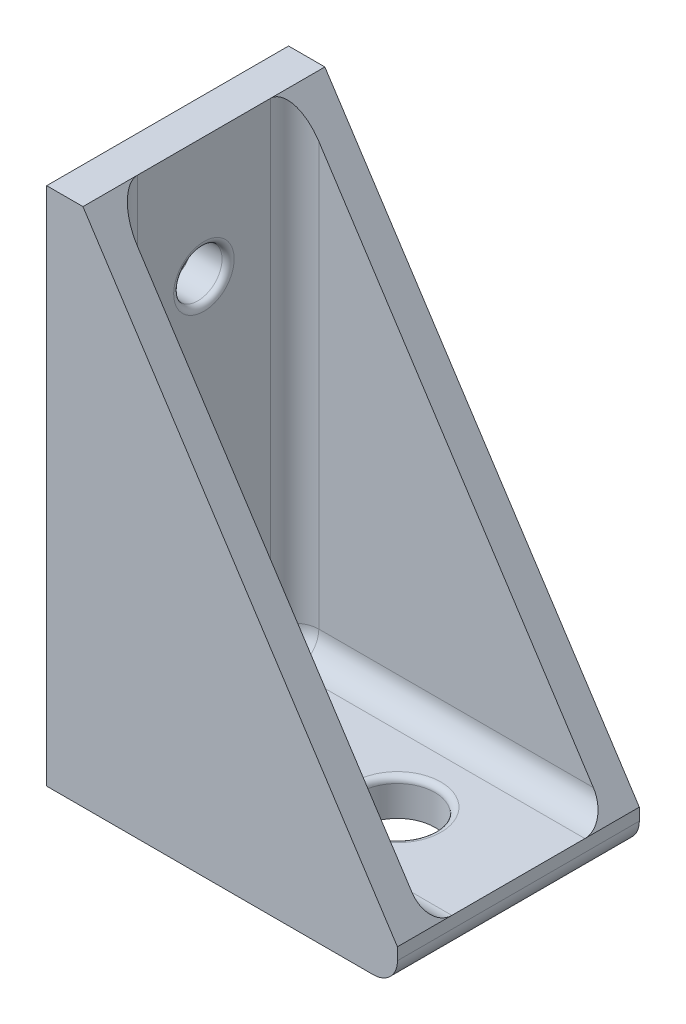
ISO-10303-21;
HEADER;
FILE_DESCRIPTION(('STEP AP214'),'2;1');
FILE_NAME('part.step','',(''),(''),'','','');
FILE_SCHEMA(('AUTOMOTIVE_DESIGN { 1 0 10303 214 1 1 1 1 }'));
ENDSEC;
DATA;
#1=APPLICATION_CONTEXT('core data for automotive mechanical design processes');
#2=APPLICATION_PROTOCOL_DEFINITION('international standard','automotive_design',2000,#1);
#3=PRODUCT_CONTEXT('',#1,'mechanical');
#4=PRODUCT('Part','Part','',(#3));
#5=PRODUCT_RELATED_PRODUCT_CATEGORY('part','',(#4));
#6=PRODUCT_DEFINITION_FORMATION('','',#4);
#7=PRODUCT_DEFINITION_CONTEXT('part definition',#1,'design');
#8=PRODUCT_DEFINITION('design','',#6,#7);
#9=PRODUCT_DEFINITION_SHAPE('','',#8);
#10=(LENGTH_UNIT() NAMED_UNIT(*) SI_UNIT(.MILLI.,.METRE.));
#11=(NAMED_UNIT(*) PLANE_ANGLE_UNIT() SI_UNIT($,.RADIAN.));
#12=(NAMED_UNIT(*) SI_UNIT($,.STERADIAN.) SOLID_ANGLE_UNIT());
#13=UNCERTAINTY_MEASURE_WITH_UNIT(LENGTH_MEASURE(1.E-05),#10,'distance_accuracy_value','');
#14=(GEOMETRIC_REPRESENTATION_CONTEXT(3) GLOBAL_UNCERTAINTY_ASSIGNED_CONTEXT((#13)) GLOBAL_UNIT_ASSIGNED_CONTEXT((#10,
#11,#12)) REPRESENTATION_CONTEXT('',''));
#15=CARTESIAN_POINT('',(0.,0.,0.));
#16=DIRECTION('',(0.,0.,1.));
#17=DIRECTION('',(1.,0.,0.));
#18=AXIS2_PLACEMENT_3D('',#15,#16,#17);
#19=CARTESIAN_POINT('',(29.,3.,20.));
#20=DIRECTION('',(0.,-1.,0.));
#21=DIRECTION('',(1.,0.,0.));
#22=AXIS2_PLACEMENT_3D('',#19,#20,#21);
#23=PLANE('',#22);
#24=CARTESIAN_POINT('',(19.,3.,10.));
#25=DIRECTION('',(0.,-1.,0.));
#26=DIRECTION('',(1.,0.,0.));
#27=AXIS2_PLACEMENT_3D('',#24,#25,#26);
#28=CIRCLE('',#27,3.6);
#29=CARTESIAN_POINT('',(22.6,3.,10.));
#30=VERTEX_POINT('',#29);
#31=EDGE_CURVE('E41',#30,#30,#28,.T.);
#32=ORIENTED_EDGE('',*,*,#31,.T.);
#33=EDGE_LOOP('',(#32));
#34=FACE_BOUND('',#33,.T.);
#35=DIRECTION('',(0.,0.,-1.));
#36=VECTOR('',#35,1.);
#37=CARTESIAN_POINT('',(5.,3.,17.5));
#38=LINE('',#37,#36);
#39=CARTESIAN_POINT('',(5.,3.,4.5));
#40=VERTEX_POINT('',#39);
#41=CARTESIAN_POINT('',(5.,3.,15.5));
#42=VERTEX_POINT('',#41);
#43=EDGE_CURVE('E307',#40,#42,#38,.F.);
#44=ORIENTED_EDGE('',*,*,#43,.T.);
#45=DIRECTION('',(1.,0.,0.));
#46=VECTOR('',#45,1.);
#47=CARTESIAN_POINT('',(29.,3.,15.5));
#48=LINE('',#47,#46);
#49=CARTESIAN_POINT('',(29.,3.,15.5));
#50=VERTEX_POINT('',#49);
#51=EDGE_CURVE('E311',#42,#50,#48,.T.);
#52=ORIENTED_EDGE('',*,*,#51,.T.);
#53=DIRECTION('',(0.,0.,-1.));
#54=VECTOR('',#53,1.);
#55=CARTESIAN_POINT('',(29.,3.,20.));
#56=LINE('',#55,#54);
#57=CARTESIAN_POINT('',(29.,3.,4.5));
#58=VERTEX_POINT('',#57);
#59=EDGE_CURVE('E285',#50,#58,#56,.T.);
#60=ORIENTED_EDGE('',*,*,#59,.T.);
#61=DIRECTION('',(-1.,0.,0.));
#62=VECTOR('',#61,1.);
#63=CARTESIAN_POINT('',(29.,3.,4.5));
#64=LINE('',#63,#62);
#65=EDGE_CURVE('E120',#58,#40,#64,.T.);
#66=ORIENTED_EDGE('',*,*,#65,.T.);
#67=EDGE_LOOP('',(#44,#52,#60,#66));
#68=FACE_BOUND('',#67,.T.);
#69=ADVANCED_FACE('F33',(#34,#68),#23,.F.);
#70=CARTESIAN_POINT('',(3.,3.,20.));
#71=DIRECTION('',(-1.,0.,0.));
#72=DIRECTION('',(0.,-1.,0.));
#73=AXIS2_PLACEMENT_3D('',#70,#71,#72);
#74=PLANE('',#73);
#75=CARTESIAN_POINT('',(3.,33.,10.));
#76=DIRECTION('',(-1.,0.,0.));
#77=DIRECTION('',(0.,-1.,0.));
#78=AXIS2_PLACEMENT_3D('',#75,#76,#77);
#79=CIRCLE('',#78,2.5);
#80=CARTESIAN_POINT('',(3.,30.5,10.));
#81=VERTEX_POINT('',#80);
#82=EDGE_CURVE('E151',#81,#81,#79,.T.);
#83=ORIENTED_EDGE('',*,*,#82,.T.);
#84=EDGE_LOOP('',(#83));
#85=FACE_BOUND('',#84,.T.);
#86=CARTESIAN_POINT('',(3.,13.,10.));
#87=DIRECTION('',(-1.,0.,0.));
#88=DIRECTION('',(0.,-1.,0.));
#89=AXIS2_PLACEMENT_3D('',#86,#87,#88);
#90=CIRCLE('',#89,2.5);
#91=CARTESIAN_POINT('',(3.,10.5,10.));
#92=VERTEX_POINT('',#91);
#93=EDGE_CURVE('E124',#92,#92,#90,.T.);
#94=ORIENTED_EDGE('',*,*,#93,.T.);
#95=EDGE_LOOP('',(#94));
#96=FACE_BOUND('',#95,.T.);
#97=DIRECTION('',(0.,0.,-1.));
#98=VECTOR('',#97,1.);
#99=CARTESIAN_POINT('',(3.,43.,20.));
#100=LINE('',#99,#98);
#101=CARTESIAN_POINT('',(3.,43.,15.5));
#102=VERTEX_POINT('',#101);
#103=CARTESIAN_POINT('',(3.,43.,4.5));
#104=VERTEX_POINT('',#103);
#105=EDGE_CURVE('E274',#102,#104,#100,.T.);
#106=ORIENTED_EDGE('',*,*,#105,.F.);
#107=DIRECTION('',(0.,-1.,0.));
#108=VECTOR('',#107,1.);
#109=CARTESIAN_POINT('',(3.,3.,15.5));
#110=LINE('',#109,#108);
#111=CARTESIAN_POINT('',(3.,5.,15.5));
#112=VERTEX_POINT('',#111);
#113=EDGE_CURVE('E108',#102,#112,#110,.T.);
#114=ORIENTED_EDGE('',*,*,#113,.T.);
#115=DIRECTION('',(0.,0.,-1.));
#116=VECTOR('',#115,1.);
#117=CARTESIAN_POINT('',(3.,5.,2.5));
#118=LINE('',#117,#116);
#119=CARTESIAN_POINT('',(3.,5.,4.5));
#120=VERTEX_POINT('',#119);
#121=EDGE_CURVE('E317',#112,#120,#118,.T.);
#122=ORIENTED_EDGE('',*,*,#121,.T.);
#123=DIRECTION('',(0.,1.,0.));
#124=VECTOR('',#123,1.);
#125=CARTESIAN_POINT('',(3.,3.,4.5));
#126=LINE('',#125,#124);
#127=EDGE_CURVE('E319',#120,#104,#126,.T.);
#128=ORIENTED_EDGE('',*,*,#127,.T.);
#129=EDGE_LOOP('',(#106,#114,#122,#128));
#130=FACE_BOUND('',#129,.T.);
#131=ADVANCED_FACE('F171',(#85,#96,#130),#74,.F.);
#132=CARTESIAN_POINT('',(3.,43.,20.));
#133=DIRECTION('',(0.,-1.,0.));
#134=DIRECTION('',(0.,0.,-1.));
#135=AXIS2_PLACEMENT_3D('',#132,#133,#134);
#136=PLANE('',#135);
#137=DIRECTION('',(-1.,0.,0.));
#138=VECTOR('',#137,1.);
#139=CARTESIAN_POINT('',(3.,43.,0.));
#140=LINE('',#139,#138);
#141=CARTESIAN_POINT('',(3.,43.,0.));
#142=VERTEX_POINT('',#141);
#143=CARTESIAN_POINT('',(0.,43.,0.));
#144=VERTEX_POINT('',#143);
#145=EDGE_CURVE('E258',#142,#144,#140,.T.);
#146=ORIENTED_EDGE('',*,*,#145,.T.);
#147=DIRECTION('',(0.,0.,-1.));
#148=VECTOR('',#147,1.);
#149=CARTESIAN_POINT('',(0.,43.,20.));
#150=LINE('',#149,#148);
#151=CARTESIAN_POINT('',(0.,43.,20.));
#152=VERTEX_POINT('',#151);
#153=EDGE_CURVE('E292',#152,#144,#150,.T.);
#154=ORIENTED_EDGE('',*,*,#153,.F.);
#155=DIRECTION('',(-1.,0.,0.));
#156=VECTOR('',#155,1.);
#157=CARTESIAN_POINT('',(3.,43.,20.));
#158=LINE('',#157,#156);
#159=CARTESIAN_POINT('',(3.,43.,20.));
#160=VERTEX_POINT('',#159);
#161=EDGE_CURVE('E261',#160,#152,#158,.T.);
#162=ORIENTED_EDGE('',*,*,#161,.F.);
#163=EDGE_CURVE('E57',#160,#102,#100,.T.);
#164=ORIENTED_EDGE('',*,*,#163,.T.);
#165=ORIENTED_EDGE('',*,*,#105,.T.);
#166=DIRECTION('',(0.,0.,-1.));
#167=VECTOR('',#166,1.);
#168=CARTESIAN_POINT('',(3.,43.,2.5));
#169=LINE('',#168,#167);
#170=EDGE_CURVE('E72',#104,#142,#169,.T.);
#171=ORIENTED_EDGE('',*,*,#170,.T.);
#172=EDGE_LOOP('',(#146,#154,#162,#164,#165,#171));
#173=FACE_BOUND('',#172,.T.);
#174=ADVANCED_FACE('F177',(#173),#136,.F.);
#175=CARTESIAN_POINT('',(0.,43.,20.));
#176=DIRECTION('',(1.,0.,0.));
#177=DIRECTION('',(0.,0.,-1.));
#178=AXIS2_PLACEMENT_3D('',#175,#176,#177);
#179=PLANE('',#178);
#180=CARTESIAN_POINT('',(0.,13.,10.));
#181=DIRECTION('',(1.,0.,0.));
#182=DIRECTION('',(0.,1.,0.));
#183=AXIS2_PLACEMENT_3D('',#180,#181,#182);
#184=CIRCLE('',#183,2.);
#185=CARTESIAN_POINT('',(0.,15.,10.));
#186=VERTEX_POINT('',#185);
#187=EDGE_CURVE('E244',#186,#186,#184,.T.);
#188=ORIENTED_EDGE('',*,*,#187,.T.);
#189=EDGE_LOOP('',(#188));
#190=FACE_BOUND('',#189,.T.);
#191=CARTESIAN_POINT('',(0.,33.,10.));
#192=DIRECTION('',(1.,0.,0.));
#193=DIRECTION('',(0.,1.,0.));
#194=AXIS2_PLACEMENT_3D('',#191,#192,#193);
#195=CIRCLE('',#194,2.);
#196=CARTESIAN_POINT('',(0.,35.,10.));
#197=VERTEX_POINT('',#196);
#198=EDGE_CURVE('E242',#197,#197,#195,.T.);
#199=ORIENTED_EDGE('',*,*,#198,.T.);
#200=EDGE_LOOP('',(#199));
#201=FACE_BOUND('',#200,.T.);
#202=DIRECTION('',(0.,-1.,0.));
#203=VECTOR('',#202,1.);
#204=CARTESIAN_POINT('',(0.,43.,0.));
#205=LINE('',#204,#203);
#206=CARTESIAN_POINT('',(0.,0.,0.));
#207=VERTEX_POINT('',#206);
#208=EDGE_CURVE('E277',#144,#207,#205,.T.);
#209=ORIENTED_EDGE('',*,*,#208,.T.);
#210=DIRECTION('',(0.,0.,-1.));
#211=VECTOR('',#210,1.);
#212=CARTESIAN_POINT('',(0.,0.,20.));
#213=LINE('',#212,#211);
#214=CARTESIAN_POINT('',(0.,0.,20.));
#215=VERTEX_POINT('',#214);
#216=EDGE_CURVE('E289',#215,#207,#213,.T.);
#217=ORIENTED_EDGE('',*,*,#216,.F.);
#218=DIRECTION('',(0.,-1.,0.));
#219=VECTOR('',#218,1.);
#220=CARTESIAN_POINT('',(0.,43.,20.));
#221=LINE('',#220,#219);
#222=EDGE_CURVE('E264',#152,#215,#221,.T.);
#223=ORIENTED_EDGE('',*,*,#222,.F.);
#224=ORIENTED_EDGE('',*,*,#153,.T.);
#225=EDGE_LOOP('',(#209,#217,#223,#224));
#226=FACE_BOUND('',#225,.T.);
#227=ADVANCED_FACE('F189',(#190,#201,#226),#179,.F.);
#228=CARTESIAN_POINT('',(0.,0.,20.));
#229=DIRECTION('',(0.,1.,0.));
#230=DIRECTION('',(0.,0.,1.));
#231=AXIS2_PLACEMENT_3D('',#228,#229,#230);
#232=PLANE('',#231);
#233=CARTESIAN_POINT('',(19.,0.,10.));
#234=DIRECTION('',(0.,-1.,0.));
#235=DIRECTION('',(0.,0.,-1.));
#236=AXIS2_PLACEMENT_3D('',#233,#234,#235);
#237=CIRCLE('',#236,3.1);
#238=CARTESIAN_POINT('',(19.,0.,6.9));
#239=VERTEX_POINT('',#238);
#240=EDGE_CURVE('E147',#239,#239,#237,.T.);
#241=ORIENTED_EDGE('',*,*,#240,.F.);
#242=EDGE_LOOP('',(#241));
#243=FACE_BOUND('',#242,.T.);
#244=DIRECTION('',(1.,0.,0.));
#245=VECTOR('',#244,1.);
#246=CARTESIAN_POINT('',(0.,0.,0.));
#247=LINE('',#246,#245);
#248=CARTESIAN_POINT('',(27.,0.,0.));
#249=VERTEX_POINT('',#248);
#250=EDGE_CURVE('E280',#207,#249,#247,.T.);
#251=ORIENTED_EDGE('',*,*,#250,.T.);
#252=DIRECTION('',(0.,0.,-1.));
#253=VECTOR('',#252,1.);
#254=CARTESIAN_POINT('',(27.,0.,20.));
#255=LINE('',#254,#253);
#256=CARTESIAN_POINT('',(27.,0.,20.));
#257=VERTEX_POINT('',#256);
#258=EDGE_CURVE('E301',#249,#257,#255,.F.);
#259=ORIENTED_EDGE('',*,*,#258,.T.);
#260=DIRECTION('',(1.,0.,0.));
#261=VECTOR('',#260,1.);
#262=CARTESIAN_POINT('',(0.,0.,20.));
#263=LINE('',#262,#261);
#264=EDGE_CURVE('E268',#215,#257,#263,.T.);
#265=ORIENTED_EDGE('',*,*,#264,.F.);
#266=ORIENTED_EDGE('',*,*,#216,.T.);
#267=EDGE_LOOP('',(#251,#259,#265,#266));
#268=FACE_BOUND('',#267,.T.);
#269=ADVANCED_FACE('F186',(#243,#268),#232,.F.);
#270=CARTESIAN_POINT('',(29.,0.,20.));
#271=DIRECTION('',(-1.,0.,0.));
#272=DIRECTION('',(0.,0.,1.));
#273=AXIS2_PLACEMENT_3D('',#270,#271,#272);
#274=PLANE('',#273);
#275=DIRECTION('',(0.,1.,0.));
#276=VECTOR('',#275,1.);
#277=CARTESIAN_POINT('',(29.,0.,20.));
#278=LINE('',#277,#276);
#279=CARTESIAN_POINT('',(29.,2.,20.));
#280=VERTEX_POINT('',#279);
#281=CARTESIAN_POINT('',(29.,3.,20.));
#282=VERTEX_POINT('',#281);
#283=EDGE_CURVE('E271',#280,#282,#278,.T.);
#284=ORIENTED_EDGE('',*,*,#283,.F.);
#285=DIRECTION('',(0.,0.,-1.));
#286=VECTOR('',#285,1.);
#287=CARTESIAN_POINT('',(29.,2.,20.));
#288=LINE('',#287,#286);
#289=CARTESIAN_POINT('',(29.,2.,0.));
#290=VERTEX_POINT('',#289);
#291=EDGE_CURVE('E295',#280,#290,#288,.T.);
#292=ORIENTED_EDGE('',*,*,#291,.T.);
#293=DIRECTION('',(0.,1.,0.));
#294=VECTOR('',#293,1.);
#295=CARTESIAN_POINT('',(29.,0.,0.));
#296=LINE('',#295,#294);
#297=CARTESIAN_POINT('',(29.,3.,0.));
#298=VERTEX_POINT('',#297);
#299=EDGE_CURVE('E265',#290,#298,#296,.T.);
#300=ORIENTED_EDGE('',*,*,#299,.T.);
#301=DIRECTION('',(0.,0.,-1.));
#302=VECTOR('',#301,1.);
#303=CARTESIAN_POINT('',(29.,3.,2.5));
#304=LINE('',#303,#302);
#305=EDGE_CURVE('E48',#58,#298,#304,.T.);
#306=ORIENTED_EDGE('',*,*,#305,.F.);
#307=ORIENTED_EDGE('',*,*,#59,.F.);
#308=EDGE_CURVE('E286',#282,#50,#56,.T.);
#309=ORIENTED_EDGE('',*,*,#308,.F.);
#310=EDGE_LOOP('',(#284,#292,#300,#306,#307,#309));
#311=FACE_BOUND('',#310,.T.);
#312=ADVANCED_FACE('F182',(#311),#274,.F.);
#313=CARTESIAN_POINT('',(0.,0.,20.));
#314=DIRECTION('',(0.,0.,1.));
#315=DIRECTION('',(1.,0.,0.));
#316=AXIS2_PLACEMENT_3D('',#313,#314,#315);
#317=PLANE('',#316);
#318=ORIENTED_EDGE('',*,*,#264,.T.);
#319=CARTESIAN_POINT('',(27.,2.,20.));
#320=DIRECTION('',(0.,0.,1.));
#321=DIRECTION('',(1.,0.,0.));
#322=AXIS2_PLACEMENT_3D('',#319,#320,#321);
#323=CIRCLE('',#322,2.);
#324=EDGE_CURVE('E304',#257,#280,#323,.T.);
#325=ORIENTED_EDGE('',*,*,#324,.T.);
#326=ORIENTED_EDGE('',*,*,#283,.T.);
#327=DIRECTION('',(-0.544988350595414,0.838443616300637,0.));
#328=VECTOR('',#327,1.);
#329=CARTESIAN_POINT('',(3.,43.,20.));
#330=LINE('',#329,#328);
#331=EDGE_CURVE('E253',#282,#160,#330,.T.);
#332=ORIENTED_EDGE('',*,*,#331,.T.);
#333=ORIENTED_EDGE('',*,*,#161,.T.);
#334=ORIENTED_EDGE('',*,*,#222,.T.);
#335=EDGE_LOOP('',(#318,#325,#326,#332,#333,#334));
#336=FACE_BOUND('',#335,.T.);
#337=ADVANCED_FACE('F185',(#336),#317,.T.);
#338=CARTESIAN_POINT('',(0.,0.,0.));
#339=DIRECTION('',(0.,0.,1.));
#340=DIRECTION('',(1.,0.,0.));
#341=AXIS2_PLACEMENT_3D('',#338,#339,#340);
#342=PLANE('',#341);
#343=ORIENTED_EDGE('',*,*,#299,.F.);
#344=CARTESIAN_POINT('',(27.,2.,0.));
#345=DIRECTION('',(0.,0.,1.));
#346=DIRECTION('',(1.,0.,0.));
#347=AXIS2_PLACEMENT_3D('',#344,#345,#346);
#348=CIRCLE('',#347,2.);
#349=EDGE_CURVE('E298',#290,#249,#348,.F.);
#350=ORIENTED_EDGE('',*,*,#349,.T.);
#351=ORIENTED_EDGE('',*,*,#250,.F.);
#352=ORIENTED_EDGE('',*,*,#208,.F.);
#353=ORIENTED_EDGE('',*,*,#145,.F.);
#354=DIRECTION('',(0.544988350595414,-0.838443616300637,0.));
#355=VECTOR('',#354,1.);
#356=CARTESIAN_POINT('',(3.,43.,0.));
#357=LINE('',#356,#355);
#358=EDGE_CURVE('E116',#142,#298,#357,.T.);
#359=ORIENTED_EDGE('',*,*,#358,.T.);
#360=EDGE_LOOP('',(#343,#350,#351,#352,#353,#359));
#361=FACE_BOUND('',#360,.T.);
#362=ADVANCED_FACE('F380',(#361),#342,.F.);
#363=CARTESIAN_POINT('',(3.,43.,17.5));
#364=DIRECTION('',(0.838443616300637,0.544988350595414,0.));
#365=DIRECTION('',(-0.544988350595414,0.838443616300637,0.));
#366=AXIS2_PLACEMENT_3D('',#363,#364,#365);
#367=PLANE('',#366);
#368=ORIENTED_EDGE('',*,*,#331,.F.);
#369=ORIENTED_EDGE('',*,*,#308,.T.);
#370=CARTESIAN_POINT('',(27.7,5.,15.5));
#371=DIRECTION('',(0.838443616300637,0.544988350595414,0.));
#372=DIRECTION('',(-0.544988350595414,0.838443616300637,0.));
#373=AXIS2_PLACEMENT_3D('',#370,#371,#372);
#374=ELLIPSE('',#373,2.38537208837531,2.);
#375=CARTESIAN_POINT('',(27.7,4.99999999999999,17.5));
#376=VERTEX_POINT('',#375);
#377=EDGE_CURVE('E323',#50,#376,#374,.F.);
#378=ORIENTED_EDGE('',*,*,#377,.T.);
#379=DIRECTION('',(-0.544988350595414,0.838443616300637,0.));
#380=VECTOR('',#379,1.);
#381=CARTESIAN_POINT('',(3.,43.,17.5));
#382=LINE('',#381,#380);
#383=CARTESIAN_POINT('',(5.,39.9230769230769,17.5));
#384=VERTEX_POINT('',#383);
#385=EDGE_CURVE('E255',#376,#384,#382,.T.);
#386=ORIENTED_EDGE('',*,*,#385,.T.);
#387=CARTESIAN_POINT('',(5.,39.9230769230769,15.5));
#388=DIRECTION('',(0.838443616300637,0.544988350595414,0.));
#389=DIRECTION('',(-0.544988350595414,0.838443616300637,0.));
#390=AXIS2_PLACEMENT_3D('',#387,#388,#389);
#391=ELLIPSE('',#390,3.6698032128851,2.);
#392=EDGE_CURVE('E126',#384,#102,#391,.F.);
#393=ORIENTED_EDGE('',*,*,#392,.T.);
#394=ORIENTED_EDGE('',*,*,#163,.F.);
#395=EDGE_LOOP('',(#368,#369,#378,#386,#393,#394));
#396=FACE_BOUND('',#395,.T.);
#397=ADVANCED_FACE('F330',(#396),#367,.T.);
#398=CARTESIAN_POINT('',(0.,0.,17.5));
#399=DIRECTION('',(0.,0.,1.));
#400=DIRECTION('',(1.,0.,0.));
#401=AXIS2_PLACEMENT_3D('',#398,#399,#400);
#402=PLANE('',#401);
#403=ORIENTED_EDGE('',*,*,#385,.F.);
#404=DIRECTION('',(1.,0.,0.));
#405=VECTOR('',#404,1.);
#406=CARTESIAN_POINT('',(3.,5.,17.5));
#407=LINE('',#406,#405);
#408=CARTESIAN_POINT('',(5.,5.,17.5));
#409=VERTEX_POINT('',#408);
#410=EDGE_CURVE('E84',#376,#409,#407,.F.);
#411=ORIENTED_EDGE('',*,*,#410,.T.);
#412=DIRECTION('',(0.,-1.,0.));
#413=VECTOR('',#412,1.);
#414=CARTESIAN_POINT('',(5.,43.,17.5));
#415=LINE('',#414,#413);
#416=EDGE_CURVE('E314',#409,#384,#415,.F.);
#417=ORIENTED_EDGE('',*,*,#416,.T.);
#418=EDGE_LOOP('',(#403,#411,#417));
#419=FACE_BOUND('',#418,.T.);
#420=ADVANCED_FACE('F351',(#419),#402,.F.);
#421=CARTESIAN_POINT('',(3.,43.,2.5));
#422=DIRECTION('',(0.838443616300637,0.544988350595414,0.));
#423=DIRECTION('',(-0.544988350595414,0.838443616300637,0.));
#424=AXIS2_PLACEMENT_3D('',#421,#422,#423);
#425=PLANE('',#424);
#426=ORIENTED_EDGE('',*,*,#358,.F.);
#427=ORIENTED_EDGE('',*,*,#170,.F.);
#428=CARTESIAN_POINT('',(5.,39.9230769230769,4.5));
#429=DIRECTION('',(0.838443616300637,0.544988350595414,0.));
#430=DIRECTION('',(-0.544988350595414,0.838443616300637,0.));
#431=AXIS2_PLACEMENT_3D('',#428,#429,#430);
#432=ELLIPSE('',#431,3.6698032128851,2.);
#433=CARTESIAN_POINT('',(5.,39.9230769230769,2.5));
#434=VERTEX_POINT('',#433);
#435=EDGE_CURVE('E115',#104,#434,#432,.F.);
#436=ORIENTED_EDGE('',*,*,#435,.T.);
#437=DIRECTION('',(0.544988350595414,-0.838443616300637,0.));
#438=VECTOR('',#437,1.);
#439=CARTESIAN_POINT('',(3.,43.,2.5));
#440=LINE('',#439,#438);
#441=CARTESIAN_POINT('',(27.7,5.,2.5));
#442=VERTEX_POINT('',#441);
#443=EDGE_CURVE('E101',#434,#442,#440,.T.);
#444=ORIENTED_EDGE('',*,*,#443,.T.);
#445=CARTESIAN_POINT('',(27.7,5.,4.5));
#446=DIRECTION('',(0.838443616300637,0.544988350595414,0.));
#447=DIRECTION('',(-0.544988350595414,0.838443616300637,0.));
#448=AXIS2_PLACEMENT_3D('',#445,#446,#447);
#449=ELLIPSE('',#448,2.38537208837531,2.);
#450=EDGE_CURVE('E112',#442,#58,#449,.F.);
#451=ORIENTED_EDGE('',*,*,#450,.T.);
#452=ORIENTED_EDGE('',*,*,#305,.T.);
#453=EDGE_LOOP('',(#426,#427,#436,#444,#451,#452));
#454=FACE_BOUND('',#453,.T.);
#455=ADVANCED_FACE('F111',(#454),#425,.T.);
#456=CARTESIAN_POINT('',(0.,0.,2.5));
#457=DIRECTION('',(0.,0.,1.));
#458=DIRECTION('',(1.,0.,0.));
#459=AXIS2_PLACEMENT_3D('',#456,#457,#458);
#460=PLANE('',#459);
#461=ORIENTED_EDGE('',*,*,#443,.F.);
#462=DIRECTION('',(0.,1.,0.));
#463=VECTOR('',#462,1.);
#464=CARTESIAN_POINT('',(5.,0.,2.5));
#465=LINE('',#464,#463);
#466=CARTESIAN_POINT('',(5.,5.,2.5));
#467=VERTEX_POINT('',#466);
#468=EDGE_CURVE('E103',#434,#467,#465,.F.);
#469=ORIENTED_EDGE('',*,*,#468,.T.);
#470=DIRECTION('',(-1.,0.,0.));
#471=VECTOR('',#470,1.);
#472=CARTESIAN_POINT('',(0.,5.,2.5));
#473=LINE('',#472,#471);
#474=EDGE_CURVE('E98',#467,#442,#473,.F.);
#475=ORIENTED_EDGE('',*,*,#474,.T.);
#476=EDGE_LOOP('',(#461,#469,#475));
#477=FACE_BOUND('',#476,.T.);
#478=ADVANCED_FACE('F100',(#477),#460,.T.);
#479=CARTESIAN_POINT('',(0.,33.,10.));
#480=DIRECTION('',(1.,0.,0.));
#481=DIRECTION('',(0.,1.,0.));
#482=AXIS2_PLACEMENT_3D('',#479,#480,#481);
#483=CYLINDRICAL_SURFACE('',#482,2.);
#484=CARTESIAN_POINT('',(2.5,33.,10.));
#485=DIRECTION('',(-1.,0.,0.));
#486=DIRECTION('',(0.,-1.,0.));
#487=AXIS2_PLACEMENT_3D('',#484,#485,#486);
#488=CIRCLE('',#487,2.);
#489=CARTESIAN_POINT('',(2.5,35.,10.));
#490=VERTEX_POINT('',#489);
#491=EDGE_CURVE('E121',#490,#490,#488,.F.);
#492=CARTESIAN_POINT('',(2.5,35.,10.));
#493=CARTESIAN_POINT('',(2.47395833333333,35.,10.));
#494=CARTESIAN_POINT('',(2.44791666666667,35.,10.));
#495=CARTESIAN_POINT('',(2.39583333333333,35.,10.));
#496=CARTESIAN_POINT('',(2.36979166666667,35.,10.));
#497=CARTESIAN_POINT('',(2.31770833333333,35.,10.));
#498=CARTESIAN_POINT('',(2.29166666666667,35.,10.));
#499=CARTESIAN_POINT('',(2.23958333333333,35.,10.));
#500=CARTESIAN_POINT('',(2.21354166666667,35.,10.));
#501=CARTESIAN_POINT('',(2.16145833333333,35.,10.));
#502=CARTESIAN_POINT('',(2.13541666666667,35.,10.));
#503=CARTESIAN_POINT('',(2.08333333333333,35.,10.));
#504=CARTESIAN_POINT('',(2.05729166666667,35.,10.));
#505=CARTESIAN_POINT('',(2.00520833333333,35.,10.));
#506=CARTESIAN_POINT('',(1.97916666666667,35.,10.));
#507=CARTESIAN_POINT('',(1.92708333333333,35.,10.));
#508=CARTESIAN_POINT('',(1.90104166666667,35.,10.));
#509=CARTESIAN_POINT('',(1.84895833333333,35.,10.));
#510=CARTESIAN_POINT('',(1.82291666666667,35.,10.));
#511=CARTESIAN_POINT('',(1.77083333333333,35.,10.));
#512=CARTESIAN_POINT('',(1.74479166666667,35.,10.));
#513=CARTESIAN_POINT('',(1.69270833333333,35.,10.));
#514=CARTESIAN_POINT('',(1.66666666666667,35.,10.));
#515=CARTESIAN_POINT('',(1.61458333333333,35.,10.));
#516=CARTESIAN_POINT('',(1.58854166666667,35.,10.));
#517=CARTESIAN_POINT('',(1.53645833333333,35.,10.));
#518=CARTESIAN_POINT('',(1.51041666666667,35.,10.));
#519=CARTESIAN_POINT('',(1.45833333333333,35.,10.));
#520=CARTESIAN_POINT('',(1.43229166666667,35.,10.));
#521=CARTESIAN_POINT('',(1.38020833333333,35.,10.));
#522=CARTESIAN_POINT('',(1.35416666666667,35.,10.));
#523=CARTESIAN_POINT('',(1.30208333333333,35.,10.));
#524=CARTESIAN_POINT('',(1.27604166666667,35.,10.));
#525=CARTESIAN_POINT('',(1.22395833333333,35.,10.));
#526=CARTESIAN_POINT('',(1.19791666666667,35.,10.));
#527=CARTESIAN_POINT('',(1.14583333333333,35.,10.));
#528=CARTESIAN_POINT('',(1.11979166666667,35.,10.));
#529=CARTESIAN_POINT('',(1.06770833333333,35.,10.));
#530=CARTESIAN_POINT('',(1.04166666666667,35.,10.));
#531=CARTESIAN_POINT('',(0.989583333333333,35.,10.));
#532=CARTESIAN_POINT('',(0.963541666666666,35.,10.));
#533=CARTESIAN_POINT('',(0.911458333333333,35.,10.));
#534=CARTESIAN_POINT('',(0.885416666666666,35.,10.));
#535=CARTESIAN_POINT('',(0.833333333333333,35.,10.));
#536=CARTESIAN_POINT('',(0.807291666666666,35.,10.));
#537=CARTESIAN_POINT('',(0.755208333333333,35.,10.));
#538=CARTESIAN_POINT('',(0.729166666666666,35.,10.));
#539=CARTESIAN_POINT('',(0.677083333333333,35.,10.));
#540=CARTESIAN_POINT('',(0.651041666666666,35.,10.));
#541=CARTESIAN_POINT('',(0.598958333333333,35.,10.));
#542=CARTESIAN_POINT('',(0.572916666666666,35.,10.));
#543=CARTESIAN_POINT('',(0.520833333333333,35.,10.));
#544=CARTESIAN_POINT('',(0.494791666666666,35.,10.));
#545=CARTESIAN_POINT('',(0.442708333333333,35.,10.));
#546=CARTESIAN_POINT('',(0.416666666666666,35.,10.));
#547=CARTESIAN_POINT('',(0.364583333333333,35.,10.));
#548=CARTESIAN_POINT('',(0.338541666666666,35.,10.));
#549=CARTESIAN_POINT('',(0.286458333333333,35.,10.));
#550=CARTESIAN_POINT('',(0.260416666666666,35.,10.));
#551=CARTESIAN_POINT('',(0.208333333333333,35.,10.));
#552=CARTESIAN_POINT('',(0.182291666666666,35.,10.));
#553=CARTESIAN_POINT('',(0.130208333333333,35.,10.));
#554=CARTESIAN_POINT('',(0.104166666666666,35.,10.));
#555=CARTESIAN_POINT('',(0.0520833333333329,35.,10.));
#556=CARTESIAN_POINT('',(0.0260416666666663,35.,10.));
#557=CARTESIAN_POINT('',(0.,35.,10.));
#558=B_SPLINE_CURVE_WITH_KNOTS('',3,(#492,#493,#494,#495,#496,#497,#498,#499,#500,#501,#502,
#503,#504,#505,#506,#507,#508,#509,#510,#511,#512,#513,#514,#515,#516,#517,#518,#519,#520,#521,
#522,#523,#524,#525,#526,#527,#528,#529,#530,#531,#532,#533,#534,#535,#536,#537,#538,#539,#540,
#541,#542,#543,#544,#545,#546,#547,#548,#549,#550,#551,#552,#553,#554,#555,#556,#557),
.UNSPECIFIED.,.F.,.F.,(4,2,2,2,2,2,2,2,2,2,2,2,2,2,2,2,2,2,2,2,2,2,2,2,2,2,2,2,2,2,2,2,4),(0.,
0.0781250000000001,0.15625,0.234375,0.3125,0.390625,0.46875,0.546875,0.625,0.703125,0.78125,
0.859375,0.9375,1.015625,1.09375,1.171875,1.25,1.328125,1.40625,1.484375,1.5625,1.640625,
1.71875,1.796875,1.875,1.953125,2.03125,2.109375,2.1875,2.265625,2.34375,2.421875,2.5),.UNSPECIFIED.);
#559=EDGE_CURVE('BSEAM235',#490,#197,#558,.T.);
#560=ORIENTED_EDGE('',*,*,#491,.T.);
#561=ORIENTED_EDGE('',*,*,#198,.F.);
#562=ORIENTED_EDGE('',*,*,#559,.T.);
#563=ORIENTED_EDGE('',*,*,#559,.F.);
#564=EDGE_LOOP('',(#560,#562,#561,#563));
#565=FACE_BOUND('',#564,.T.);
#566=ADVANCED_FACE('F235',(#565),#483,.F.);
#567=CARTESIAN_POINT('',(0.,13.,10.));
#568=DIRECTION('',(1.,0.,0.));
#569=DIRECTION('',(0.,1.,0.));
#570=AXIS2_PLACEMENT_3D('',#567,#568,#569);
#571=CYLINDRICAL_SURFACE('',#570,2.);
#572=CARTESIAN_POINT('',(2.5,13.,10.));
#573=DIRECTION('',(-1.,0.,0.));
#574=DIRECTION('',(0.,-1.,0.));
#575=AXIS2_PLACEMENT_3D('',#572,#573,#574);
#576=CIRCLE('',#575,2.);
#577=CARTESIAN_POINT('',(2.5,15.,10.));
#578=VERTEX_POINT('',#577);
#579=EDGE_CURVE('E154',#578,#578,#576,.F.);
#580=CARTESIAN_POINT('',(2.5,15.,10.));
#581=CARTESIAN_POINT('',(2.47395833333333,15.,10.));
#582=CARTESIAN_POINT('',(2.44791666666667,15.,10.));
#583=CARTESIAN_POINT('',(2.39583333333333,15.,10.));
#584=CARTESIAN_POINT('',(2.36979166666667,15.,10.));
#585=CARTESIAN_POINT('',(2.31770833333333,15.,10.));
#586=CARTESIAN_POINT('',(2.29166666666667,15.,10.));
#587=CARTESIAN_POINT('',(2.23958333333333,15.,10.));
#588=CARTESIAN_POINT('',(2.21354166666667,15.,10.));
#589=CARTESIAN_POINT('',(2.16145833333333,15.,10.));
#590=CARTESIAN_POINT('',(2.13541666666667,15.,10.));
#591=CARTESIAN_POINT('',(2.08333333333333,15.,10.));
#592=CARTESIAN_POINT('',(2.05729166666667,15.,10.));
#593=CARTESIAN_POINT('',(2.00520833333333,15.,10.));
#594=CARTESIAN_POINT('',(1.97916666666667,15.,10.));
#595=CARTESIAN_POINT('',(1.92708333333333,15.,10.));
#596=CARTESIAN_POINT('',(1.90104166666667,15.,10.));
#597=CARTESIAN_POINT('',(1.84895833333333,15.,10.));
#598=CARTESIAN_POINT('',(1.82291666666667,15.,10.));
#599=CARTESIAN_POINT('',(1.77083333333333,15.,10.));
#600=CARTESIAN_POINT('',(1.74479166666667,15.,10.));
#601=CARTESIAN_POINT('',(1.69270833333333,15.,10.));
#602=CARTESIAN_POINT('',(1.66666666666667,15.,10.));
#603=CARTESIAN_POINT('',(1.61458333333333,15.,10.));
#604=CARTESIAN_POINT('',(1.58854166666667,15.,10.));
#605=CARTESIAN_POINT('',(1.53645833333333,15.,10.));
#606=CARTESIAN_POINT('',(1.51041666666667,15.,10.));
#607=CARTESIAN_POINT('',(1.45833333333333,15.,10.));
#608=CARTESIAN_POINT('',(1.43229166666667,15.,10.));
#609=CARTESIAN_POINT('',(1.38020833333333,15.,10.));
#610=CARTESIAN_POINT('',(1.35416666666667,15.,10.));
#611=CARTESIAN_POINT('',(1.30208333333333,15.,10.));
#612=CARTESIAN_POINT('',(1.27604166666667,15.,10.));
#613=CARTESIAN_POINT('',(1.22395833333333,15.,10.));
#614=CARTESIAN_POINT('',(1.19791666666667,15.,10.));
#615=CARTESIAN_POINT('',(1.14583333333333,15.,10.));
#616=CARTESIAN_POINT('',(1.11979166666667,15.,10.));
#617=CARTESIAN_POINT('',(1.06770833333333,15.,10.));
#618=CARTESIAN_POINT('',(1.04166666666667,15.,10.));
#619=CARTESIAN_POINT('',(0.989583333333333,15.,10.));
#620=CARTESIAN_POINT('',(0.963541666666667,15.,10.));
#621=CARTESIAN_POINT('',(0.911458333333333,15.,10.));
#622=CARTESIAN_POINT('',(0.885416666666667,15.,10.));
#623=CARTESIAN_POINT('',(0.833333333333333,15.,10.));
#624=CARTESIAN_POINT('',(0.807291666666667,15.,10.));
#625=CARTESIAN_POINT('',(0.755208333333333,15.,10.));
#626=CARTESIAN_POINT('',(0.729166666666667,15.,10.));
#627=CARTESIAN_POINT('',(0.677083333333333,15.,10.));
#628=CARTESIAN_POINT('',(0.651041666666667,15.,10.));
#629=CARTESIAN_POINT('',(0.598958333333333,15.,10.));
#630=CARTESIAN_POINT('',(0.572916666666667,15.,10.));
#631=CARTESIAN_POINT('',(0.520833333333333,15.,10.));
#632=CARTESIAN_POINT('',(0.494791666666667,15.,10.));
#633=CARTESIAN_POINT('',(0.442708333333333,15.,10.));
#634=CARTESIAN_POINT('',(0.416666666666667,15.,10.));
#635=CARTESIAN_POINT('',(0.364583333333333,15.,10.));
#636=CARTESIAN_POINT('',(0.338541666666667,15.,10.));
#637=CARTESIAN_POINT('',(0.286458333333334,15.,10.));
#638=CARTESIAN_POINT('',(0.260416666666667,15.,10.));
#639=CARTESIAN_POINT('',(0.208333333333333,15.,10.));
#640=CARTESIAN_POINT('',(0.182291666666667,15.,10.));
#641=CARTESIAN_POINT('',(0.130208333333333,15.,10.));
#642=CARTESIAN_POINT('',(0.104166666666667,15.,10.));
#643=CARTESIAN_POINT('',(0.0520833333333334,15.,10.));
#644=CARTESIAN_POINT('',(0.0260416666666667,15.,10.));
#645=CARTESIAN_POINT('',(0.,15.,10.));
#646=B_SPLINE_CURVE_WITH_KNOTS('',3,(#580,#581,#582,#583,#584,#585,#586,#587,#588,#589,#590,
#591,#592,#593,#594,#595,#596,#597,#598,#599,#600,#601,#602,#603,#604,#605,#606,#607,#608,#609,
#610,#611,#612,#613,#614,#615,#616,#617,#618,#619,#620,#621,#622,#623,#624,#625,#626,#627,#628,
#629,#630,#631,#632,#633,#634,#635,#636,#637,#638,#639,#640,#641,#642,#643,#644,#645),
.UNSPECIFIED.,.F.,.F.,(4,2,2,2,2,2,2,2,2,2,2,2,2,2,2,2,2,2,2,2,2,2,2,2,2,2,2,2,2,2,2,2,4),(0.,
0.0781250000000001,0.15625,0.234375,0.3125,0.390625,0.46875,0.546875,0.625,0.703125,0.78125,
0.859375,0.9375,1.015625,1.09375,1.171875,1.25,1.328125,1.40625,1.484375,1.5625,1.640625,
1.71875,1.796875,1.875,1.953125,2.03125,2.109375,2.1875,2.265625,2.34375,2.421875,2.5),.UNSPECIFIED.);
#647=EDGE_CURVE('BSEAM238',#578,#186,#646,.T.);
#648=ORIENTED_EDGE('',*,*,#579,.T.);
#649=ORIENTED_EDGE('',*,*,#187,.F.);
#650=ORIENTED_EDGE('',*,*,#647,.T.);
#651=ORIENTED_EDGE('',*,*,#647,.F.);
#652=EDGE_LOOP('',(#648,#650,#649,#651));
#653=FACE_BOUND('',#652,.T.);
#654=ADVANCED_FACE('F238',(#653),#571,.F.);
#655=CARTESIAN_POINT('',(19.,43.,10.));
#656=DIRECTION('',(0.,-1.,0.));
#657=DIRECTION('',(0.,0.,-1.));
#658=AXIS2_PLACEMENT_3D('',#655,#656,#657);
#659=CYLINDRICAL_SURFACE('',#658,3.1);
#660=CARTESIAN_POINT('',(19.,2.5,10.));
#661=DIRECTION('',(0.,-1.,0.));
#662=DIRECTION('',(1.,0.,0.));
#663=AXIS2_PLACEMENT_3D('',#660,#661,#662);
#664=CIRCLE('',#663,3.1);
#665=CARTESIAN_POINT('',(22.1,2.5,10.));
#666=VERTEX_POINT('',#665);
#667=EDGE_CURVE('E11',#666,#666,#664,.F.);
#668=ORIENTED_EDGE('',*,*,#667,.T.);
#669=EDGE_LOOP('',(#668));
#670=FACE_BOUND('',#669,.T.);
#671=ORIENTED_EDGE('',*,*,#240,.T.);
#672=EDGE_LOOP('',(#671));
#673=FACE_BOUND('',#672,.T.);
#674=ADVANCED_FACE('F200',(#670,#673),#659,.F.);
#675=CARTESIAN_POINT('',(27.,2.,20.));
#676=DIRECTION('',(0.,0.,-1.));
#677=DIRECTION('',(-1.,0.,0.));
#678=AXIS2_PLACEMENT_3D('',#675,#676,#677);
#679=CYLINDRICAL_SURFACE('',#678,2.);
#680=ORIENTED_EDGE('',*,*,#324,.F.);
#681=ORIENTED_EDGE('',*,*,#258,.F.);
#682=ORIENTED_EDGE('',*,*,#349,.F.);
#683=ORIENTED_EDGE('',*,*,#291,.F.);
#684=EDGE_LOOP('',(#680,#681,#682,#683));
#685=FACE_BOUND('',#684,.T.);
#686=ADVANCED_FACE('F196',(#685),#679,.T.);
#687=CARTESIAN_POINT('',(5.,3.,4.5));
#688=DIRECTION('',(0.,1.,0.));
#689=DIRECTION('',(-1.,0.,0.));
#690=AXIS2_PLACEMENT_3D('',#687,#688,#689);
#691=CYLINDRICAL_SURFACE('',#690,2.);
#692=ORIENTED_EDGE('',*,*,#435,.F.);
#693=ORIENTED_EDGE('',*,*,#127,.F.);
#694=CARTESIAN_POINT('',(5.,5.,4.5));
#695=DIRECTION('',(0.,1.,0.));
#696=DIRECTION('',(0.,0.,1.));
#697=AXIS2_PLACEMENT_3D('',#694,#695,#696);
#698=CIRCLE('',#697,2.);
#699=EDGE_CURVE('E145',#467,#120,#698,.T.);
#700=ORIENTED_EDGE('',*,*,#699,.F.);
#701=ORIENTED_EDGE('',*,*,#468,.F.);
#702=EDGE_LOOP('',(#692,#693,#700,#701));
#703=FACE_BOUND('',#702,.T.);
#704=ADVANCED_FACE('F199',(#703),#691,.F.);
#705=CARTESIAN_POINT('',(29.,5.,4.5));
#706=DIRECTION('',(-1.,0.,0.));
#707=DIRECTION('',(0.,-1.,0.));
#708=AXIS2_PLACEMENT_3D('',#705,#706,#707);
#709=CYLINDRICAL_SURFACE('',#708,2.);
#710=ORIENTED_EDGE('',*,*,#450,.F.);
#711=ORIENTED_EDGE('',*,*,#474,.F.);
#712=CARTESIAN_POINT('',(5.,5.,4.5));
#713=DIRECTION('',(1.,0.,0.));
#714=DIRECTION('',(0.,0.,-1.));
#715=AXIS2_PLACEMENT_3D('',#712,#713,#714);
#716=CIRCLE('',#715,2.);
#717=EDGE_CURVE('E142',#40,#467,#716,.T.);
#718=ORIENTED_EDGE('',*,*,#717,.F.);
#719=ORIENTED_EDGE('',*,*,#65,.F.);
#720=EDGE_LOOP('',(#710,#711,#718,#719));
#721=FACE_BOUND('',#720,.T.);
#722=ADVANCED_FACE('F118',(#721),#709,.F.);
#723=CARTESIAN_POINT('',(5.,5.,4.5));
#724=DIRECTION('',(0.,0.,1.));
#725=DIRECTION('',(1.,0.,0.));
#726=AXIS2_PLACEMENT_3D('',#723,#724,#725);
#727=SPHERICAL_SURFACE('',#726,2.);
#728=ORIENTED_EDGE('',*,*,#717,.T.);
#729=ORIENTED_EDGE('',*,*,#699,.T.);
#730=CARTESIAN_POINT('',(5.,5.,4.5));
#731=DIRECTION('',(0.,0.,1.));
#732=DIRECTION('',(1.,0.,0.));
#733=AXIS2_PLACEMENT_3D('',#730,#731,#732);
#734=CIRCLE('',#733,2.);
#735=EDGE_CURVE('E139',#40,#120,#734,.F.);
#736=ORIENTED_EDGE('',*,*,#735,.F.);
#737=EDGE_LOOP('',(#728,#729,#736));
#738=FACE_BOUND('',#737,.T.);
#739=ADVANCED_FACE('F217',(#738),#727,.F.);
#740=CARTESIAN_POINT('',(5.,3.,15.5));
#741=DIRECTION('',(0.,1.,0.));
#742=DIRECTION('',(-1.,0.,0.));
#743=AXIS2_PLACEMENT_3D('',#740,#741,#742);
#744=CYLINDRICAL_SURFACE('',#743,2.);
#745=ORIENTED_EDGE('',*,*,#392,.F.);
#746=ORIENTED_EDGE('',*,*,#416,.F.);
#747=CARTESIAN_POINT('',(5.,5.,15.5));
#748=DIRECTION('',(0.,1.,0.));
#749=DIRECTION('',(0.,0.,1.));
#750=AXIS2_PLACEMENT_3D('',#747,#748,#749);
#751=CIRCLE('',#750,2.);
#752=EDGE_CURVE('E136',#112,#409,#751,.T.);
#753=ORIENTED_EDGE('',*,*,#752,.F.);
#754=ORIENTED_EDGE('',*,*,#113,.F.);
#755=EDGE_LOOP('',(#745,#746,#753,#754));
#756=FACE_BOUND('',#755,.T.);
#757=ADVANCED_FACE('F213',(#756),#744,.F.);
#758=CARTESIAN_POINT('',(5.,5.,20.));
#759=DIRECTION('',(0.,0.,1.));
#760=DIRECTION('',(1.,0.,0.));
#761=AXIS2_PLACEMENT_3D('',#758,#759,#760);
#762=CYLINDRICAL_SURFACE('',#761,2.);
#763=ORIENTED_EDGE('',*,*,#735,.T.);
#764=ORIENTED_EDGE('',*,*,#121,.F.);
#765=CARTESIAN_POINT('',(5.,5.,15.5));
#766=DIRECTION('',(0.,0.,-1.));
#767=DIRECTION('',(-1.,0.,0.));
#768=AXIS2_PLACEMENT_3D('',#765,#766,#767);
#769=CIRCLE('',#768,2.);
#770=EDGE_CURVE('E133',#42,#112,#769,.T.);
#771=ORIENTED_EDGE('',*,*,#770,.F.);
#772=ORIENTED_EDGE('',*,*,#43,.F.);
#773=EDGE_LOOP('',(#763,#764,#771,#772));
#774=FACE_BOUND('',#773,.T.);
#775=ADVANCED_FACE('F209',(#774),#762,.F.);
#776=CARTESIAN_POINT('',(5.,5.,15.5));
#777=DIRECTION('',(0.,0.,1.));
#778=DIRECTION('',(1.,0.,0.));
#779=AXIS2_PLACEMENT_3D('',#776,#777,#778);
#780=SPHERICAL_SURFACE('',#779,2.);
#781=ORIENTED_EDGE('',*,*,#770,.T.);
#782=ORIENTED_EDGE('',*,*,#752,.T.);
#783=CARTESIAN_POINT('',(5.,5.,15.5));
#784=DIRECTION('',(1.,0.,0.));
#785=DIRECTION('',(0.,0.,-1.));
#786=AXIS2_PLACEMENT_3D('',#783,#784,#785);
#787=CIRCLE('',#786,2.);
#788=EDGE_CURVE('E130',#42,#409,#787,.F.);
#789=ORIENTED_EDGE('',*,*,#788,.F.);
#790=EDGE_LOOP('',(#781,#782,#789));
#791=FACE_BOUND('',#790,.T.);
#792=ADVANCED_FACE('F205',(#791),#780,.F.);
#793=CARTESIAN_POINT('',(29.,5.,15.5));
#794=DIRECTION('',(-1.,0.,0.));
#795=DIRECTION('',(0.,-1.,0.));
#796=AXIS2_PLACEMENT_3D('',#793,#794,#795);
#797=CYLINDRICAL_SURFACE('',#796,2.);
#798=ORIENTED_EDGE('',*,*,#788,.T.);
#799=ORIENTED_EDGE('',*,*,#410,.F.);
#800=ORIENTED_EDGE('',*,*,#377,.F.);
#801=ORIENTED_EDGE('',*,*,#51,.F.);
#802=EDGE_LOOP('',(#798,#799,#800,#801));
#803=FACE_BOUND('',#802,.T.);
#804=ADVANCED_FACE('F202',(#803),#797,.F.);
#805=CARTESIAN_POINT('',(2.5,33.,10.));
#806=DIRECTION('',(-1.,0.,0.));
#807=DIRECTION('',(0.,-1.,0.));
#808=AXIS2_PLACEMENT_3D('',#805,#806,#807);
#809=TOROIDAL_SURFACE('',#808,2.5,0.5);
#810=ORIENTED_EDGE('',*,*,#82,.F.);
#811=EDGE_LOOP('',(#810));
#812=FACE_BOUND('',#811,.T.);
#813=ORIENTED_EDGE('',*,*,#491,.F.);
#814=EDGE_LOOP('',(#813));
#815=FACE_BOUND('',#814,.T.);
#816=ADVANCED_FACE('F167',(#812,#815),#809,.T.);
#817=CARTESIAN_POINT('',(2.5,13.,10.));
#818=DIRECTION('',(-1.,0.,0.));
#819=DIRECTION('',(0.,-1.,0.));
#820=AXIS2_PLACEMENT_3D('',#817,#818,#819);
#821=TOROIDAL_SURFACE('',#820,2.5,0.5);
#822=ORIENTED_EDGE('',*,*,#93,.F.);
#823=EDGE_LOOP('',(#822));
#824=FACE_BOUND('',#823,.T.);
#825=ORIENTED_EDGE('',*,*,#579,.F.);
#826=EDGE_LOOP('',(#825));
#827=FACE_BOUND('',#826,.T.);
#828=ADVANCED_FACE('F162',(#824,#827),#821,.T.);
#829=CARTESIAN_POINT('',(19.,2.5,10.));
#830=DIRECTION('',(0.,-1.,0.));
#831=DIRECTION('',(1.,0.,0.));
#832=AXIS2_PLACEMENT_3D('',#829,#830,#831);
#833=TOROIDAL_SURFACE('',#832,3.6,0.5);
#834=ORIENTED_EDGE('',*,*,#667,.F.);
#835=EDGE_LOOP('',(#834));
#836=FACE_BOUND('',#835,.T.);
#837=ORIENTED_EDGE('',*,*,#31,.F.);
#838=EDGE_LOOP('',(#837));
#839=FACE_BOUND('',#838,.T.);
#840=ADVANCED_FACE('F35',(#836,#839),#833,.T.);
#841=CLOSED_SHELL('',(#69,#131,#174,#227,#269,#312,#337,#362,#397,#420,#455,#478,#566,#654,#674,
#686,#704,#722,#739,#757,#775,#792,#804,#816,#828,#840));
#842=MANIFOLD_SOLID_BREP('B2',#841);
#843=ADVANCED_BREP_SHAPE_REPRESENTATION('',(#18,#842),#14);
#844=SHAPE_DEFINITION_REPRESENTATION(#9,#843);
ENDSEC;
END-ISO-10303-21;
